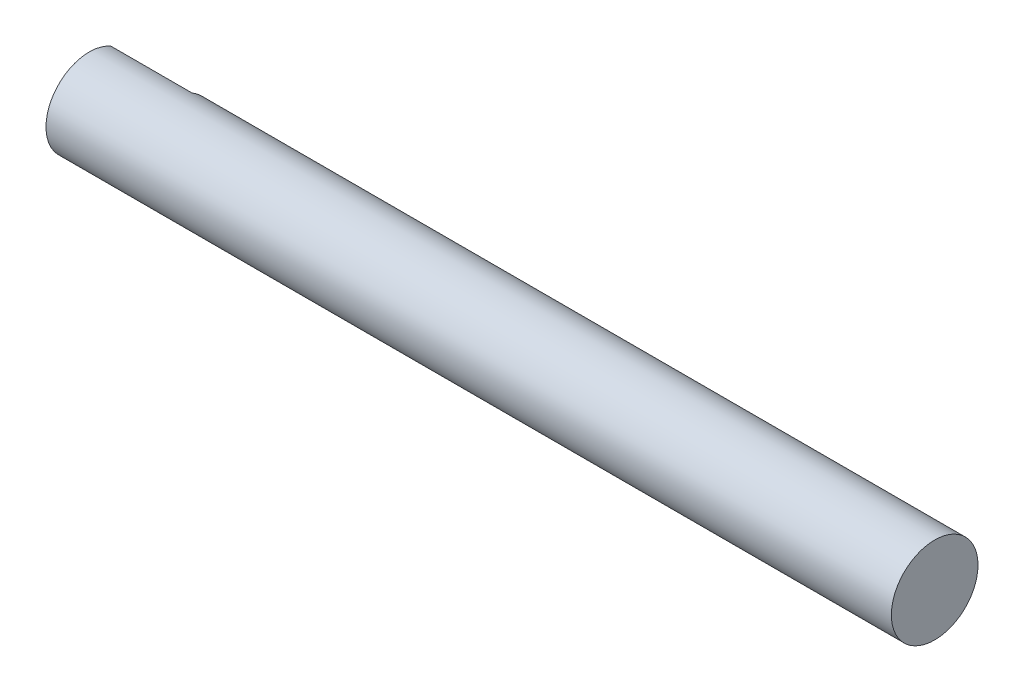
ISO-10303-21;
HEADER;
FILE_DESCRIPTION(('STEP AP214'),'2;1');
FILE_NAME('part.step','',(''),(''),'','','');
FILE_SCHEMA(('AUTOMOTIVE_DESIGN { 1 0 10303 214 1 1 1 1 }'));
ENDSEC;
DATA;
#1=APPLICATION_CONTEXT('core data for automotive mechanical design processes');
#2=APPLICATION_PROTOCOL_DEFINITION('international standard','automotive_design',2000,#1);
#3=PRODUCT_CONTEXT('',#1,'mechanical');
#4=PRODUCT('Part','Part','',(#3));
#5=PRODUCT_RELATED_PRODUCT_CATEGORY('part','',(#4));
#6=PRODUCT_DEFINITION_FORMATION('','',#4);
#7=PRODUCT_DEFINITION_CONTEXT('part definition',#1,'design');
#8=PRODUCT_DEFINITION('design','',#6,#7);
#9=PRODUCT_DEFINITION_SHAPE('','',#8);
#10=(LENGTH_UNIT() NAMED_UNIT(*) SI_UNIT(.MILLI.,.METRE.));
#11=(NAMED_UNIT(*) PLANE_ANGLE_UNIT() SI_UNIT($,.RADIAN.));
#12=(NAMED_UNIT(*) SI_UNIT($,.STERADIAN.) SOLID_ANGLE_UNIT());
#13=UNCERTAINTY_MEASURE_WITH_UNIT(LENGTH_MEASURE(1.E-05),#10,'distance_accuracy_value','');
#14=(GEOMETRIC_REPRESENTATION_CONTEXT(3) GLOBAL_UNCERTAINTY_ASSIGNED_CONTEXT((#13)) GLOBAL_UNIT_ASSIGNED_CONTEXT((#10,
#11,#12)) REPRESENTATION_CONTEXT('',''));
#15=CARTESIAN_POINT('',(0.,0.,0.));
#16=DIRECTION('',(0.,0.,1.));
#17=DIRECTION('',(1.,0.,0.));
#18=AXIS2_PLACEMENT_3D('',#15,#16,#17);
#19=CARTESIAN_POINT('',(7.5,0.,0.));
#20=DIRECTION('',(-1.,0.,0.));
#21=DIRECTION('',(0.,0.,1.));
#22=AXIS2_PLACEMENT_3D('',#19,#20,#21);
#23=CYLINDRICAL_SURFACE('',#22,3.995);
#24=CARTESIAN_POINT('',(0.,0.,0.));
#25=DIRECTION('',(1.,0.,0.));
#26=DIRECTION('',(0.,0.,-1.));
#27=AXIS2_PLACEMENT_3D('',#24,#25,#26);
#28=CIRCLE('',#27,3.995);
#29=CARTESIAN_POINT('',(0.,3.46695832106473,-1.985));
#30=VERTEX_POINT('',#29);
#31=CARTESIAN_POINT('',(0.,-3.46695832106473,-1.985));
#32=VERTEX_POINT('',#31);
#33=EDGE_CURVE('E77',#30,#32,#28,.T.);
#34=ORIENTED_EDGE('',*,*,#33,.T.);
#35=DIRECTION('',(-1.,0.,0.));
#36=VECTOR('',#35,1.);
#37=CARTESIAN_POINT('',(7.5,-3.46695832106473,-1.985));
#38=LINE('',#37,#36);
#39=CARTESIAN_POINT('',(7.5,-3.46695832106473,-1.985));
#40=VERTEX_POINT('',#39);
#41=EDGE_CURVE('E11',#40,#32,#38,.T.);
#42=ORIENTED_EDGE('',*,*,#41,.F.);
#43=CARTESIAN_POINT('',(7.5,0.,0.));
#44=DIRECTION('',(1.,0.,0.));
#45=DIRECTION('',(0.,0.,-1.));
#46=AXIS2_PLACEMENT_3D('',#43,#44,#45);
#47=CIRCLE('',#46,3.995);
#48=CARTESIAN_POINT('',(7.5,3.46695832106473,-1.985));
#49=VERTEX_POINT('',#48);
#50=EDGE_CURVE('E71',#40,#49,#47,.T.);
#51=ORIENTED_EDGE('',*,*,#50,.T.);
#52=DIRECTION('',(-1.,0.,0.));
#53=VECTOR('',#52,1.);
#54=CARTESIAN_POINT('',(7.5,3.46695832106473,-1.985));
#55=LINE('',#54,#53);
#56=EDGE_CURVE('E47',#49,#30,#55,.T.);
#57=ORIENTED_EDGE('',*,*,#56,.T.);
#58=EDGE_LOOP('',(#34,#42,#51,#57));
#59=FACE_BOUND('',#58,.T.);
#60=CARTESIAN_POINT('',(77.946,0.,0.));
#61=DIRECTION('',(1.,0.,0.));
#62=DIRECTION('',(0.,0.,-1.));
#63=AXIS2_PLACEMENT_3D('',#60,#61,#62);
#64=CIRCLE('',#63,3.995);
#65=CARTESIAN_POINT('',(77.946,0.,-3.995));
#66=VERTEX_POINT('',#65);
#67=EDGE_CURVE('E74',#66,#66,#64,.T.);
#68=ORIENTED_EDGE('',*,*,#67,.F.);
#69=EDGE_LOOP('',(#68));
#70=FACE_BOUND('',#69,.T.);
#71=ADVANCED_FACE('F39',(#59,#70),#23,.T.);
#72=CARTESIAN_POINT('',(7.5,3.46695832106473,-1.985));
#73=DIRECTION('',(0.,0.,1.));
#74=DIRECTION('',(1.,0.,0.));
#75=AXIS2_PLACEMENT_3D('',#72,#73,#74);
#76=PLANE('',#75);
#77=DIRECTION('',(0.,1.,0.));
#78=VECTOR('',#77,1.);
#79=CARTESIAN_POINT('',(0.,3.46695832106473,-1.985));
#80=LINE('',#79,#78);
#81=EDGE_CURVE('E62',#32,#30,#80,.T.);
#82=ORIENTED_EDGE('',*,*,#81,.T.);
#83=ORIENTED_EDGE('',*,*,#56,.F.);
#84=DIRECTION('',(0.,1.,0.));
#85=VECTOR('',#84,1.);
#86=CARTESIAN_POINT('',(7.5,3.46695832106473,-1.985));
#87=LINE('',#86,#85);
#88=EDGE_CURVE('E53',#40,#49,#87,.T.);
#89=ORIENTED_EDGE('',*,*,#88,.F.);
#90=ORIENTED_EDGE('',*,*,#41,.T.);
#91=EDGE_LOOP('',(#82,#83,#89,#90));
#92=FACE_BOUND('',#91,.T.);
#93=ADVANCED_FACE('F64',(#92),#76,.F.);
#94=CARTESIAN_POINT('',(0.,0.,0.));
#95=DIRECTION('',(1.,0.,0.));
#96=DIRECTION('',(0.,0.,-1.));
#97=AXIS2_PLACEMENT_3D('',#94,#95,#96);
#98=PLANE('',#97);
#99=ORIENTED_EDGE('',*,*,#33,.F.);
#100=ORIENTED_EDGE('',*,*,#81,.F.);
#101=EDGE_LOOP('',(#99,#100));
#102=FACE_BOUND('',#101,.T.);
#103=ADVANCED_FACE('F81',(#102),#98,.F.);
#104=CARTESIAN_POINT('',(7.5,0.,0.));
#105=DIRECTION('',(1.,0.,0.));
#106=DIRECTION('',(0.,0.,-1.));
#107=AXIS2_PLACEMENT_3D('',#104,#105,#106);
#108=PLANE('',#107);
#109=ORIENTED_EDGE('',*,*,#50,.F.);
#110=ORIENTED_EDGE('',*,*,#88,.T.);
#111=EDGE_LOOP('',(#109,#110));
#112=FACE_BOUND('',#111,.T.);
#113=ADVANCED_FACE('F70',(#112),#108,.F.);
#114=CARTESIAN_POINT('',(77.946,0.,0.));
#115=DIRECTION('',(1.,0.,0.));
#116=DIRECTION('',(0.,0.,-1.));
#117=AXIS2_PLACEMENT_3D('',#114,#115,#116);
#118=PLANE('',#117);
#119=ORIENTED_EDGE('',*,*,#67,.T.);
#120=EDGE_LOOP('',(#119));
#121=FACE_BOUND('',#120,.T.);
#122=ADVANCED_FACE('F88',(#121),#118,.T.);
#123=CLOSED_SHELL('',(#71,#93,#103,#113,#122));
#124=MANIFOLD_SOLID_BREP('B2',#123);
#125=ADVANCED_BREP_SHAPE_REPRESENTATION('',(#18,#124),#14);
#126=SHAPE_DEFINITION_REPRESENTATION(#9,#125);
ENDSEC;
END-ISO-10303-21;
